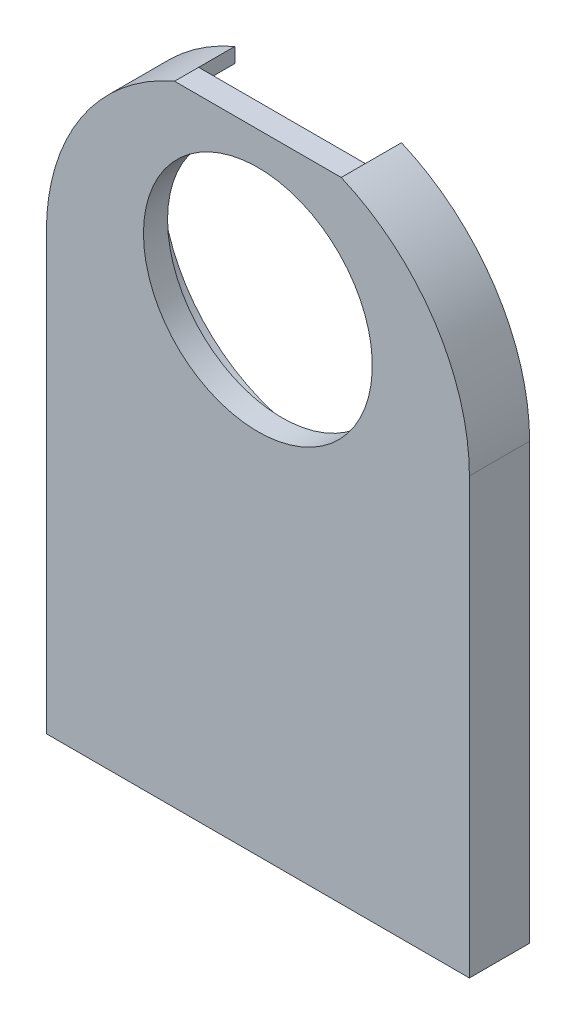
ISO-10303-21;
HEADER;
FILE_DESCRIPTION(('STEP AP214'),'2;1');
FILE_NAME('part.step','',(''),(''),'','','');
FILE_SCHEMA(('AUTOMOTIVE_DESIGN { 1 0 10303 214 1 1 1 1 }'));
ENDSEC;
DATA;
#1=APPLICATION_CONTEXT('core data for automotive mechanical design processes');
#2=APPLICATION_PROTOCOL_DEFINITION('international standard','automotive_design',2000,#1);
#3=PRODUCT_CONTEXT('',#1,'mechanical');
#4=PRODUCT('Part','Part','',(#3));
#5=PRODUCT_RELATED_PRODUCT_CATEGORY('part','',(#4));
#6=PRODUCT_DEFINITION_FORMATION('','',#4);
#7=PRODUCT_DEFINITION_CONTEXT('part definition',#1,'design');
#8=PRODUCT_DEFINITION('design','',#6,#7);
#9=PRODUCT_DEFINITION_SHAPE('','',#8);
#10=(LENGTH_UNIT() NAMED_UNIT(*) SI_UNIT(.MILLI.,.METRE.));
#11=(NAMED_UNIT(*) PLANE_ANGLE_UNIT() SI_UNIT($,.RADIAN.));
#12=(NAMED_UNIT(*) SI_UNIT($,.STERADIAN.) SOLID_ANGLE_UNIT());
#13=UNCERTAINTY_MEASURE_WITH_UNIT(LENGTH_MEASURE(1.E-05),#10,'distance_accuracy_value','');
#14=(GEOMETRIC_REPRESENTATION_CONTEXT(3) GLOBAL_UNCERTAINTY_ASSIGNED_CONTEXT((#13)) GLOBAL_UNIT_ASSIGNED_CONTEXT((#10,
#11,#12)) REPRESENTATION_CONTEXT('',''));
#15=CARTESIAN_POINT('',(0.,0.,0.));
#16=DIRECTION('',(0.,0.,1.));
#17=DIRECTION('',(1.,0.,0.));
#18=AXIS2_PLACEMENT_3D('',#15,#16,#17);
#19=CARTESIAN_POINT('',(8.78,8.5,1.5));
#20=DIRECTION('',(0.,0.,-1.));
#21=DIRECTION('',(-1.,0.,0.));
#22=AXIS2_PLACEMENT_3D('',#19,#20,#21);
#23=CYLINDRICAL_SURFACE('',#22,6.5);
#24=CARTESIAN_POINT('',(8.78,8.5,0.));
#25=DIRECTION('',(0.,0.,1.));
#26=DIRECTION('',(1.,0.,0.));
#27=AXIS2_PLACEMENT_3D('',#24,#25,#26);
#28=CIRCLE('',#27,6.5);
#29=CARTESIAN_POINT('',(5.32,14.0025812124856,0.));
#30=VERTEX_POINT('',#29);
#31=CARTESIAN_POINT('',(12.24,14.0025812124856,0.));
#32=VERTEX_POINT('',#31);
#33=EDGE_CURVE('E99',#30,#32,#28,.T.);
#34=ORIENTED_EDGE('',*,*,#33,.F.);
#35=DIRECTION('',(0.,0.,-1.));
#36=VECTOR('',#35,1.);
#37=CARTESIAN_POINT('',(5.32,14.0025812124856,1.5));
#38=LINE('',#37,#36);
#39=CARTESIAN_POINT('',(5.32,14.0025812124856,1.5));
#40=VERTEX_POINT('',#39);
#41=EDGE_CURVE('E11',#40,#30,#38,.T.);
#42=ORIENTED_EDGE('',*,*,#41,.F.);
#43=CARTESIAN_POINT('',(8.78,8.5,1.5));
#44=DIRECTION('',(0.,0.,1.));
#45=DIRECTION('',(1.,0.,0.));
#46=AXIS2_PLACEMENT_3D('',#43,#44,#45);
#47=CIRCLE('',#46,6.5);
#48=CARTESIAN_POINT('',(12.24,14.0025812124856,1.5));
#49=VERTEX_POINT('',#48);
#50=EDGE_CURVE('E100',#40,#49,#47,.T.);
#51=ORIENTED_EDGE('',*,*,#50,.T.);
#52=DIRECTION('',(0.,0.,-1.));
#53=VECTOR('',#52,1.);
#54=CARTESIAN_POINT('',(12.24,14.0025812124856,1.5));
#55=LINE('',#54,#53);
#56=EDGE_CURVE('E83',#49,#32,#55,.T.);
#57=ORIENTED_EDGE('',*,*,#56,.T.);
#58=EDGE_LOOP('',(#34,#42,#51,#57));
#59=FACE_BOUND('',#58,.T.);
#60=ADVANCED_FACE('F35',(#59),#23,.F.);
#61=CARTESIAN_POINT('',(5.32,0.,1.5));
#62=DIRECTION('',(-1.,0.,0.));
#63=DIRECTION('',(0.,0.,1.));
#64=AXIS2_PLACEMENT_3D('',#61,#62,#63);
#65=PLANE('',#64);
#66=DIRECTION('',(0.,1.,0.));
#67=VECTOR('',#66,1.);
#68=CARTESIAN_POINT('',(5.32,0.,0.));
#69=LINE('',#68,#67);
#70=CARTESIAN_POINT('',(5.32,14.6194981256581,0.));
#71=VERTEX_POINT('',#70);
#72=EDGE_CURVE('E126',#30,#71,#69,.T.);
#73=ORIENTED_EDGE('',*,*,#72,.T.);
#74=DIRECTION('',(0.,0.,-1.));
#75=VECTOR('',#74,1.);
#76=CARTESIAN_POINT('',(5.32,14.6194981256581,1.5));
#77=LINE('',#76,#75);
#78=CARTESIAN_POINT('',(5.32,14.6194981256581,1.5));
#79=VERTEX_POINT('',#78);
#80=EDGE_CURVE('E43',#79,#71,#77,.T.);
#81=ORIENTED_EDGE('',*,*,#80,.F.);
#82=DIRECTION('',(0.,1.,0.));
#83=VECTOR('',#82,1.);
#84=CARTESIAN_POINT('',(5.32,0.,1.5));
#85=LINE('',#84,#83);
#86=EDGE_CURVE('E103',#40,#79,#85,.T.);
#87=ORIENTED_EDGE('',*,*,#86,.F.);
#88=ORIENTED_EDGE('',*,*,#41,.T.);
#89=EDGE_LOOP('',(#73,#81,#87,#88));
#90=FACE_BOUND('',#89,.T.);
#91=ADVANCED_FACE('F191',(#90),#65,.F.);
#92=CARTESIAN_POINT('',(8.78,6.55,1.5));
#93=DIRECTION('',(0.,0.,-1.));
#94=DIRECTION('',(-1.,0.,0.));
#95=AXIS2_PLACEMENT_3D('',#92,#93,#94);
#96=CYLINDRICAL_SURFACE('',#95,8.78);
#97=CARTESIAN_POINT('',(8.78,6.55,0.));
#98=DIRECTION('',(0.,0.,1.));
#99=DIRECTION('',(1.,0.,0.));
#100=AXIS2_PLACEMENT_3D('',#97,#98,#99);
#101=CIRCLE('',#100,8.78);
#102=CARTESIAN_POINT('',(0.,6.55,0.));
#103=VERTEX_POINT('',#102);
#104=EDGE_CURVE('E118',#71,#103,#101,.T.);
#105=ORIENTED_EDGE('',*,*,#104,.T.);
#106=DIRECTION('',(0.,0.,-1.));
#107=VECTOR('',#106,1.);
#108=CARTESIAN_POINT('',(0.,6.55,1.5));
#109=LINE('',#108,#107);
#110=CARTESIAN_POINT('',(0.,6.55,2.5));
#111=VERTEX_POINT('',#110);
#112=EDGE_CURVE('E109',#111,#103,#109,.T.);
#113=ORIENTED_EDGE('',*,*,#112,.F.);
#114=CARTESIAN_POINT('',(8.78,6.55,2.5));
#115=DIRECTION('',(0.,0.,1.));
#116=DIRECTION('',(1.,0.,0.));
#117=AXIS2_PLACEMENT_3D('',#114,#115,#116);
#118=CIRCLE('',#117,8.78);
#119=CARTESIAN_POINT('',(5.32,14.6194981256581,2.5));
#120=VERTEX_POINT('',#119);
#121=EDGE_CURVE('E173',#120,#111,#118,.T.);
#122=ORIENTED_EDGE('',*,*,#121,.F.);
#123=DIRECTION('',(0.,0.,-1.));
#124=VECTOR('',#123,1.);
#125=CARTESIAN_POINT('',(5.32,14.6194981256581,2.5));
#126=LINE('',#125,#124);
#127=EDGE_CURVE('E123',#120,#79,#126,.T.);
#128=ORIENTED_EDGE('',*,*,#127,.T.);
#129=ORIENTED_EDGE('',*,*,#80,.T.);
#130=EDGE_LOOP('',(#105,#113,#122,#128,#129));
#131=FACE_BOUND('',#130,.T.);
#132=ADVANCED_FACE('F116',(#131),#96,.T.);
#133=CARTESIAN_POINT('',(0.,0.,1.5));
#134=DIRECTION('',(-1.,0.,0.));
#135=DIRECTION('',(0.,0.,1.));
#136=AXIS2_PLACEMENT_3D('',#133,#134,#135);
#137=PLANE('',#136);
#138=DIRECTION('',(0.,1.,0.));
#139=VECTOR('',#138,1.);
#140=CARTESIAN_POINT('',(0.,0.,0.));
#141=LINE('',#140,#139);
#142=CARTESIAN_POINT('',(0.,-11.5,0.));
#143=VERTEX_POINT('',#142);
#144=EDGE_CURVE('E129',#143,#103,#141,.T.);
#145=ORIENTED_EDGE('',*,*,#144,.F.);
#146=DIRECTION('',(0.,0.,-1.));
#147=VECTOR('',#146,1.);
#148=CARTESIAN_POINT('',(0.,-11.5,2.5));
#149=LINE('',#148,#147);
#150=CARTESIAN_POINT('',(0.,-11.5,2.5));
#151=VERTEX_POINT('',#150);
#152=EDGE_CURVE('E154',#151,#143,#149,.T.);
#153=ORIENTED_EDGE('',*,*,#152,.F.);
#154=DIRECTION('',(0.,-1.,0.));
#155=VECTOR('',#154,1.);
#156=CARTESIAN_POINT('',(0.,0.,2.5));
#157=LINE('',#156,#155);
#158=EDGE_CURVE('E176',#111,#151,#157,.T.);
#159=ORIENTED_EDGE('',*,*,#158,.F.);
#160=ORIENTED_EDGE('',*,*,#112,.T.);
#161=EDGE_LOOP('',(#145,#153,#159,#160));
#162=FACE_BOUND('',#161,.T.);
#163=ADVANCED_FACE('F208',(#162),#137,.T.);
#164=CARTESIAN_POINT('',(17.56,0.,1.5));
#165=DIRECTION('',(-1.,0.,0.));
#166=DIRECTION('',(0.,0.,1.));
#167=AXIS2_PLACEMENT_3D('',#164,#165,#166);
#168=PLANE('',#167);
#169=DIRECTION('',(0.,1.,0.));
#170=VECTOR('',#169,1.);
#171=CARTESIAN_POINT('',(17.56,0.,0.));
#172=LINE('',#171,#170);
#173=CARTESIAN_POINT('',(17.56,-11.5,0.));
#174=VERTEX_POINT('',#173);
#175=CARTESIAN_POINT('',(17.56,6.55,0.));
#176=VERTEX_POINT('',#175);
#177=EDGE_CURVE('E93',#174,#176,#172,.T.);
#178=ORIENTED_EDGE('',*,*,#177,.T.);
#179=DIRECTION('',(0.,0.,-1.));
#180=VECTOR('',#179,1.);
#181=CARTESIAN_POINT('',(17.56,6.55,1.5));
#182=LINE('',#181,#180);
#183=CARTESIAN_POINT('',(17.56,6.55,2.5));
#184=VERTEX_POINT('',#183);
#185=EDGE_CURVE('E82',#184,#176,#182,.T.);
#186=ORIENTED_EDGE('',*,*,#185,.F.);
#187=DIRECTION('',(0.,1.,0.));
#188=VECTOR('',#187,1.);
#189=CARTESIAN_POINT('',(17.56,0.,2.5));
#190=LINE('',#189,#188);
#191=CARTESIAN_POINT('',(17.56,-11.5,2.5));
#192=VERTEX_POINT('',#191);
#193=EDGE_CURVE('E179',#192,#184,#190,.T.);
#194=ORIENTED_EDGE('',*,*,#193,.F.);
#195=DIRECTION('',(0.,0.,1.));
#196=VECTOR('',#195,1.);
#197=CARTESIAN_POINT('',(17.56,-11.5,0.));
#198=LINE('',#197,#196);
#199=EDGE_CURVE('E142',#174,#192,#198,.T.);
#200=ORIENTED_EDGE('',*,*,#199,.F.);
#201=EDGE_LOOP('',(#178,#186,#194,#200));
#202=FACE_BOUND('',#201,.T.);
#203=ADVANCED_FACE('F136',(#202),#168,.F.);
#204=CARTESIAN_POINT('',(8.78,6.55,1.5));
#205=DIRECTION('',(0.,0.,-1.));
#206=DIRECTION('',(-1.,0.,0.));
#207=AXIS2_PLACEMENT_3D('',#204,#205,#206);
#208=CYLINDRICAL_SURFACE('',#207,8.78);
#209=CARTESIAN_POINT('',(8.78,6.55,0.));
#210=DIRECTION('',(0.,0.,1.));
#211=DIRECTION('',(1.,0.,0.));
#212=AXIS2_PLACEMENT_3D('',#209,#210,#211);
#213=CIRCLE('',#212,8.78);
#214=CARTESIAN_POINT('',(12.24,14.6194981256581,0.));
#215=VERTEX_POINT('',#214);
#216=EDGE_CURVE('E87',#176,#215,#213,.T.);
#217=ORIENTED_EDGE('',*,*,#216,.T.);
#218=DIRECTION('',(0.,0.,-1.));
#219=VECTOR('',#218,1.);
#220=CARTESIAN_POINT('',(12.24,14.6194981256581,1.5));
#221=LINE('',#220,#219);
#222=CARTESIAN_POINT('',(12.24,14.6194981256581,1.5));
#223=VERTEX_POINT('',#222);
#224=EDGE_CURVE('E73',#223,#215,#221,.T.);
#225=ORIENTED_EDGE('',*,*,#224,.F.);
#226=DIRECTION('',(0.,0.,-1.));
#227=VECTOR('',#226,1.);
#228=CARTESIAN_POINT('',(12.24,14.6194981256581,2.5));
#229=LINE('',#228,#227);
#230=CARTESIAN_POINT('',(12.24,14.6194981256581,2.5));
#231=VERTEX_POINT('',#230);
#232=EDGE_CURVE('E183',#231,#223,#229,.T.);
#233=ORIENTED_EDGE('',*,*,#232,.F.);
#234=CARTESIAN_POINT('',(8.78,6.55,2.5));
#235=DIRECTION('',(0.,0.,1.));
#236=DIRECTION('',(1.,0.,0.));
#237=AXIS2_PLACEMENT_3D('',#234,#235,#236);
#238=CIRCLE('',#237,8.78);
#239=EDGE_CURVE('E167',#184,#231,#238,.T.);
#240=ORIENTED_EDGE('',*,*,#239,.F.);
#241=ORIENTED_EDGE('',*,*,#185,.T.);
#242=EDGE_LOOP('',(#217,#225,#233,#240,#241));
#243=FACE_BOUND('',#242,.T.);
#244=ADVANCED_FACE('F88',(#243),#208,.T.);
#245=CARTESIAN_POINT('',(12.24,0.,1.5));
#246=DIRECTION('',(-1.,0.,0.));
#247=DIRECTION('',(0.,0.,1.));
#248=AXIS2_PLACEMENT_3D('',#245,#246,#247);
#249=PLANE('',#248);
#250=DIRECTION('',(0.,1.,0.));
#251=VECTOR('',#250,1.);
#252=CARTESIAN_POINT('',(12.24,0.,0.));
#253=LINE('',#252,#251);
#254=EDGE_CURVE('E78',#32,#215,#253,.T.);
#255=ORIENTED_EDGE('',*,*,#254,.F.);
#256=ORIENTED_EDGE('',*,*,#56,.F.);
#257=DIRECTION('',(0.,1.,0.));
#258=VECTOR('',#257,1.);
#259=CARTESIAN_POINT('',(12.24,0.,1.5));
#260=LINE('',#259,#258);
#261=EDGE_CURVE('E79',#49,#223,#260,.T.);
#262=ORIENTED_EDGE('',*,*,#261,.T.);
#263=ORIENTED_EDGE('',*,*,#224,.T.);
#264=EDGE_LOOP('',(#255,#256,#262,#263));
#265=FACE_BOUND('',#264,.T.);
#266=ADVANCED_FACE('F75',(#265),#249,.T.);
#267=CARTESIAN_POINT('',(0.,0.,0.));
#268=DIRECTION('',(0.,0.,1.));
#269=DIRECTION('',(1.,0.,0.));
#270=AXIS2_PLACEMENT_3D('',#267,#268,#269);
#271=PLANE('',#270);
#272=ORIENTED_EDGE('',*,*,#33,.T.);
#273=ORIENTED_EDGE('',*,*,#254,.T.);
#274=ORIENTED_EDGE('',*,*,#216,.F.);
#275=ORIENTED_EDGE('',*,*,#177,.F.);
#276=DIRECTION('',(1.,0.,0.));
#277=VECTOR('',#276,1.);
#278=CARTESIAN_POINT('',(0.,-11.5,0.));
#279=LINE('',#278,#277);
#280=EDGE_CURVE('E145',#143,#174,#279,.T.);
#281=ORIENTED_EDGE('',*,*,#280,.F.);
#282=ORIENTED_EDGE('',*,*,#144,.T.);
#283=ORIENTED_EDGE('',*,*,#104,.F.);
#284=ORIENTED_EDGE('',*,*,#72,.F.);
#285=EDGE_LOOP('',(#272,#273,#274,#275,#281,#282,#283,#284));
#286=FACE_BOUND('',#285,.T.);
#287=ADVANCED_FACE('F96',(#286),#271,.F.);
#288=CARTESIAN_POINT('',(0.,0.,1.5));
#289=DIRECTION('',(0.,0.,1.));
#290=DIRECTION('',(1.,0.,0.));
#291=AXIS2_PLACEMENT_3D('',#288,#289,#290);
#292=PLANE('',#291);
#293=CARTESIAN_POINT('',(8.78,8.5,1.5));
#294=DIRECTION('',(0.,0.,-1.));
#295=DIRECTION('',(-1.,0.,0.));
#296=AXIS2_PLACEMENT_3D('',#293,#294,#295);
#297=CIRCLE('',#296,4.75);
#298=CARTESIAN_POINT('',(4.03,8.5,1.5));
#299=VERTEX_POINT('',#298);
#300=EDGE_CURVE('E156',#299,#299,#297,.T.);
#301=ORIENTED_EDGE('',*,*,#300,.F.);
#302=EDGE_LOOP('',(#301));
#303=FACE_BOUND('',#302,.T.);
#304=ORIENTED_EDGE('',*,*,#50,.F.);
#305=ORIENTED_EDGE('',*,*,#86,.T.);
#306=DIRECTION('',(1.,0.,0.));
#307=VECTOR('',#306,1.);
#308=CARTESIAN_POINT('',(0.,14.6194981256581,1.5));
#309=LINE('',#308,#307);
#310=EDGE_CURVE('E50',#79,#223,#309,.T.);
#311=ORIENTED_EDGE('',*,*,#310,.T.);
#312=ORIENTED_EDGE('',*,*,#261,.F.);
#313=EDGE_LOOP('',(#304,#305,#311,#312));
#314=FACE_BOUND('',#313,.T.);
#315=ADVANCED_FACE('F187',(#303,#314),#292,.F.);
#316=CARTESIAN_POINT('',(0.,14.6194981256581,2.5));
#317=DIRECTION('',(0.,1.,0.));
#318=DIRECTION('',(0.,0.,1.));
#319=AXIS2_PLACEMENT_3D('',#316,#317,#318);
#320=PLANE('',#319);
#321=ORIENTED_EDGE('',*,*,#310,.F.);
#322=ORIENTED_EDGE('',*,*,#127,.F.);
#323=DIRECTION('',(1.,0.,0.));
#324=VECTOR('',#323,1.);
#325=CARTESIAN_POINT('',(0.,14.6194981256581,2.5));
#326=LINE('',#325,#324);
#327=EDGE_CURVE('E170',#120,#231,#326,.T.);
#328=ORIENTED_EDGE('',*,*,#327,.T.);
#329=ORIENTED_EDGE('',*,*,#232,.T.);
#330=EDGE_LOOP('',(#321,#322,#328,#329));
#331=FACE_BOUND('',#330,.T.);
#332=ADVANCED_FACE('F210',(#331),#320,.T.);
#333=CARTESIAN_POINT('',(0.,0.,2.5));
#334=DIRECTION('',(0.,0.,1.));
#335=DIRECTION('',(1.,0.,0.));
#336=AXIS2_PLACEMENT_3D('',#333,#334,#335);
#337=PLANE('',#336);
#338=CARTESIAN_POINT('',(8.78,8.5,2.5));
#339=DIRECTION('',(0.,0.,-1.));
#340=DIRECTION('',(-1.,0.,0.));
#341=AXIS2_PLACEMENT_3D('',#338,#339,#340);
#342=CIRCLE('',#341,4.75);
#343=CARTESIAN_POINT('',(4.03,8.5,2.5));
#344=VERTEX_POINT('',#343);
#345=EDGE_CURVE('E162',#344,#344,#342,.T.);
#346=ORIENTED_EDGE('',*,*,#345,.T.);
#347=EDGE_LOOP('',(#346));
#348=FACE_BOUND('',#347,.T.);
#349=ORIENTED_EDGE('',*,*,#239,.T.);
#350=ORIENTED_EDGE('',*,*,#327,.F.);
#351=ORIENTED_EDGE('',*,*,#121,.T.);
#352=ORIENTED_EDGE('',*,*,#158,.T.);
#353=DIRECTION('',(-1.,0.,0.));
#354=VECTOR('',#353,1.);
#355=CARTESIAN_POINT('',(17.56,-11.5,2.5));
#356=LINE('',#355,#354);
#357=EDGE_CURVE('E158',#192,#151,#356,.T.);
#358=ORIENTED_EDGE('',*,*,#357,.F.);
#359=ORIENTED_EDGE('',*,*,#193,.T.);
#360=EDGE_LOOP('',(#349,#350,#351,#352,#358,#359));
#361=FACE_BOUND('',#360,.T.);
#362=ADVANCED_FACE('F205',(#348,#361),#337,.T.);
#363=CARTESIAN_POINT('',(8.78,8.5,2.5));
#364=DIRECTION('',(0.,0.,-1.));
#365=DIRECTION('',(-1.,0.,0.));
#366=AXIS2_PLACEMENT_3D('',#363,#364,#365);
#367=CYLINDRICAL_SURFACE('',#366,4.75);
#368=ORIENTED_EDGE('',*,*,#345,.F.);
#369=EDGE_LOOP('',(#368));
#370=FACE_BOUND('',#369,.T.);
#371=ORIENTED_EDGE('',*,*,#300,.T.);
#372=EDGE_LOOP('',(#371));
#373=FACE_BOUND('',#372,.T.);
#374=ADVANCED_FACE('F218',(#370,#373),#367,.F.);
#375=CARTESIAN_POINT('',(0.,-11.5,0.));
#376=DIRECTION('',(0.,-1.,0.));
#377=DIRECTION('',(0.,0.,-1.));
#378=AXIS2_PLACEMENT_3D('',#375,#376,#377);
#379=PLANE('',#378);
#380=ORIENTED_EDGE('',*,*,#357,.T.);
#381=ORIENTED_EDGE('',*,*,#152,.T.);
#382=ORIENTED_EDGE('',*,*,#280,.T.);
#383=ORIENTED_EDGE('',*,*,#199,.T.);
#384=EDGE_LOOP('',(#380,#381,#382,#383));
#385=FACE_BOUND('',#384,.T.);
#386=ADVANCED_FACE('F151',(#385),#379,.T.);
#387=CLOSED_SHELL('',(#60,#91,#132,#163,#203,#244,#266,#287,#315,#332,#362,#374,#386));
#388=MANIFOLD_SOLID_BREP('B2',#387);
#389=ADVANCED_BREP_SHAPE_REPRESENTATION('',(#18,#388),#14);
#390=SHAPE_DEFINITION_REPRESENTATION(#9,#389);
ENDSEC;
END-ISO-10303-21;
